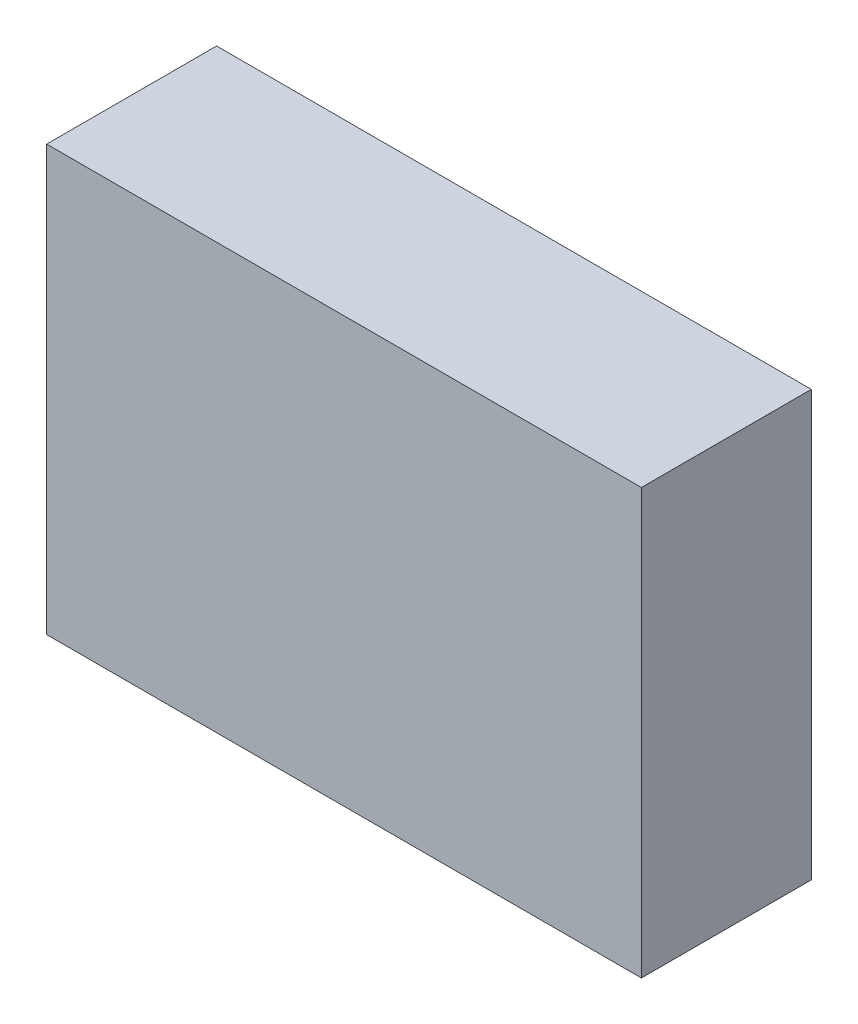
ISO-10303-21;
HEADER;
FILE_DESCRIPTION(('STEP AP214'),'2;1');
FILE_NAME('part.step','',(''),(''),'','','');
FILE_SCHEMA(('AUTOMOTIVE_DESIGN { 1 0 10303 214 1 1 1 1 }'));
ENDSEC;
DATA;
#1=APPLICATION_CONTEXT('core data for automotive mechanical design processes');
#2=APPLICATION_PROTOCOL_DEFINITION('international standard','automotive_design',2000,#1);
#3=PRODUCT_CONTEXT('',#1,'mechanical');
#4=PRODUCT('Part','Part','',(#3));
#5=PRODUCT_RELATED_PRODUCT_CATEGORY('part','',(#4));
#6=PRODUCT_DEFINITION_FORMATION('','',#4);
#7=PRODUCT_DEFINITION_CONTEXT('part definition',#1,'design');
#8=PRODUCT_DEFINITION('design','',#6,#7);
#9=PRODUCT_DEFINITION_SHAPE('','',#8);
#10=(LENGTH_UNIT() NAMED_UNIT(*) SI_UNIT(.MILLI.,.METRE.));
#11=(NAMED_UNIT(*) PLANE_ANGLE_UNIT() SI_UNIT($,.RADIAN.));
#12=(NAMED_UNIT(*) SI_UNIT($,.STERADIAN.) SOLID_ANGLE_UNIT());
#13=UNCERTAINTY_MEASURE_WITH_UNIT(LENGTH_MEASURE(1.E-05),#10,'distance_accuracy_value','');
#14=(GEOMETRIC_REPRESENTATION_CONTEXT(3) GLOBAL_UNCERTAINTY_ASSIGNED_CONTEXT((#13)) GLOBAL_UNIT_ASSIGNED_CONTEXT((#10,
#11,#12)) REPRESENTATION_CONTEXT('',''));
#15=CARTESIAN_POINT('',(0.,0.,0.));
#16=DIRECTION('',(0.,0.,1.));
#17=DIRECTION('',(1.,0.,0.));
#18=AXIS2_PLACEMENT_3D('',#15,#16,#17);
#19=CARTESIAN_POINT('',(0.,0.,20.));
#20=DIRECTION('',(1.,0.,0.));
#21=DIRECTION('',(0.,0.,-1.));
#22=AXIS2_PLACEMENT_3D('',#19,#20,#21);
#23=PLANE('',#22);
#24=DIRECTION('',(0.,-1.,0.));
#25=VECTOR('',#24,1.);
#26=CARTESIAN_POINT('',(0.,0.,0.));
#27=LINE('',#26,#25);
#28=CARTESIAN_POINT('',(0.,50.,0.));
#29=VERTEX_POINT('',#28);
#30=CARTESIAN_POINT('',(0.,0.,0.));
#31=VERTEX_POINT('',#30);
#32=EDGE_CURVE('E107',#29,#31,#27,.T.);
#33=ORIENTED_EDGE('',*,*,#32,.T.);
#34=DIRECTION('',(0.,0.,-1.));
#35=VECTOR('',#34,1.);
#36=CARTESIAN_POINT('',(0.,0.,20.));
#37=LINE('',#36,#35);
#38=CARTESIAN_POINT('',(0.,0.,20.));
#39=VERTEX_POINT('',#38);
#40=EDGE_CURVE('E11',#39,#31,#37,.T.);
#41=ORIENTED_EDGE('',*,*,#40,.F.);
#42=DIRECTION('',(0.,-1.,0.));
#43=VECTOR('',#42,1.);
#44=CARTESIAN_POINT('',(0.,0.,20.));
#45=LINE('',#44,#43);
#46=CARTESIAN_POINT('',(0.,50.,20.));
#47=VERTEX_POINT('',#46);
#48=EDGE_CURVE('E91',#47,#39,#45,.T.);
#49=ORIENTED_EDGE('',*,*,#48,.F.);
#50=DIRECTION('',(0.,0.,-1.));
#51=VECTOR('',#50,1.);
#52=CARTESIAN_POINT('',(0.,50.,20.));
#53=LINE('',#52,#51);
#54=EDGE_CURVE('E103',#47,#29,#53,.T.);
#55=ORIENTED_EDGE('',*,*,#54,.T.);
#56=EDGE_LOOP('',(#33,#41,#49,#55));
#57=FACE_BOUND('',#56,.T.);
#58=ADVANCED_FACE('F39',(#57),#23,.F.);
#59=CARTESIAN_POINT('',(0.,0.,20.));
#60=DIRECTION('',(0.,1.,0.));
#61=DIRECTION('',(0.,0.,1.));
#62=AXIS2_PLACEMENT_3D('',#59,#60,#61);
#63=PLANE('',#62);
#64=DIRECTION('',(1.,0.,0.));
#65=VECTOR('',#64,1.);
#66=CARTESIAN_POINT('',(0.,0.,0.));
#67=LINE('',#66,#65);
#68=CARTESIAN_POINT('',(70.,0.,0.));
#69=VERTEX_POINT('',#68);
#70=EDGE_CURVE('E96',#31,#69,#67,.T.);
#71=ORIENTED_EDGE('',*,*,#70,.T.);
#72=DIRECTION('',(0.,0.,-1.));
#73=VECTOR('',#72,1.);
#74=CARTESIAN_POINT('',(70.,0.,20.));
#75=LINE('',#74,#73);
#76=CARTESIAN_POINT('',(70.,0.,20.));
#77=VERTEX_POINT('',#76);
#78=EDGE_CURVE('E48',#77,#69,#75,.T.);
#79=ORIENTED_EDGE('',*,*,#78,.F.);
#80=DIRECTION('',(1.,0.,0.));
#81=VECTOR('',#80,1.);
#82=CARTESIAN_POINT('',(0.,0.,20.));
#83=LINE('',#82,#81);
#84=EDGE_CURVE('E86',#39,#77,#83,.T.);
#85=ORIENTED_EDGE('',*,*,#84,.F.);
#86=ORIENTED_EDGE('',*,*,#40,.T.);
#87=EDGE_LOOP('',(#71,#79,#85,#86));
#88=FACE_BOUND('',#87,.T.);
#89=ADVANCED_FACE('F95',(#88),#63,.F.);
#90=CARTESIAN_POINT('',(70.,0.,20.));
#91=DIRECTION('',(-1.,0.,0.));
#92=DIRECTION('',(0.,-1.,0.));
#93=AXIS2_PLACEMENT_3D('',#90,#91,#92);
#94=PLANE('',#93);
#95=DIRECTION('',(0.,1.,0.));
#96=VECTOR('',#95,1.);
#97=CARTESIAN_POINT('',(70.,0.,0.));
#98=LINE('',#97,#96);
#99=CARTESIAN_POINT('',(70.,50.,0.));
#100=VERTEX_POINT('',#99);
#101=EDGE_CURVE('E73',#69,#100,#98,.T.);
#102=ORIENTED_EDGE('',*,*,#101,.T.);
#103=DIRECTION('',(0.,0.,-1.));
#104=VECTOR('',#103,1.);
#105=CARTESIAN_POINT('',(70.,50.,20.));
#106=LINE('',#105,#104);
#107=CARTESIAN_POINT('',(70.,50.,20.));
#108=VERTEX_POINT('',#107);
#109=EDGE_CURVE('E98',#108,#100,#106,.T.);
#110=ORIENTED_EDGE('',*,*,#109,.F.);
#111=DIRECTION('',(0.,1.,0.));
#112=VECTOR('',#111,1.);
#113=CARTESIAN_POINT('',(70.,0.,20.));
#114=LINE('',#113,#112);
#115=EDGE_CURVE('E89',#77,#108,#114,.T.);
#116=ORIENTED_EDGE('',*,*,#115,.F.);
#117=ORIENTED_EDGE('',*,*,#78,.T.);
#118=EDGE_LOOP('',(#102,#110,#116,#117));
#119=FACE_BOUND('',#118,.T.);
#120=ADVANCED_FACE('F99',(#119),#94,.F.);
#121=CARTESIAN_POINT('',(0.,50.,20.));
#122=DIRECTION('',(0.,-1.,0.));
#123=DIRECTION('',(0.,0.,-1.));
#124=AXIS2_PLACEMENT_3D('',#121,#122,#123);
#125=PLANE('',#124);
#126=DIRECTION('',(-1.,0.,0.));
#127=VECTOR('',#126,1.);
#128=CARTESIAN_POINT('',(0.,50.,0.));
#129=LINE('',#128,#127);
#130=EDGE_CURVE('E79',#100,#29,#129,.T.);
#131=ORIENTED_EDGE('',*,*,#130,.T.);
#132=ORIENTED_EDGE('',*,*,#54,.F.);
#133=DIRECTION('',(-1.,0.,0.));
#134=VECTOR('',#133,1.);
#135=CARTESIAN_POINT('',(0.,50.,20.));
#136=LINE('',#135,#134);
#137=EDGE_CURVE('E56',#108,#47,#136,.T.);
#138=ORIENTED_EDGE('',*,*,#137,.F.);
#139=ORIENTED_EDGE('',*,*,#109,.T.);
#140=EDGE_LOOP('',(#131,#132,#138,#139));
#141=FACE_BOUND('',#140,.T.);
#142=ADVANCED_FACE('F120',(#141),#125,.F.);
#143=CARTESIAN_POINT('',(0.,0.,20.));
#144=DIRECTION('',(0.,0.,-1.));
#145=DIRECTION('',(-1.,0.,0.));
#146=AXIS2_PLACEMENT_3D('',#143,#144,#145);
#147=PLANE('',#146);
#148=ORIENTED_EDGE('',*,*,#48,.T.);
#149=ORIENTED_EDGE('',*,*,#84,.T.);
#150=ORIENTED_EDGE('',*,*,#115,.T.);
#151=ORIENTED_EDGE('',*,*,#137,.T.);
#152=EDGE_LOOP('',(#148,#149,#150,#151));
#153=FACE_BOUND('',#152,.T.);
#154=ADVANCED_FACE('F87',(#153),#147,.F.);
#155=CARTESIAN_POINT('',(0.,0.,0.));
#156=DIRECTION('',(0.,0.,-1.));
#157=DIRECTION('',(-1.,0.,0.));
#158=AXIS2_PLACEMENT_3D('',#155,#156,#157);
#159=PLANE('',#158);
#160=ORIENTED_EDGE('',*,*,#32,.F.);
#161=ORIENTED_EDGE('',*,*,#130,.F.);
#162=ORIENTED_EDGE('',*,*,#101,.F.);
#163=ORIENTED_EDGE('',*,*,#70,.F.);
#164=EDGE_LOOP('',(#160,#161,#162,#163));
#165=FACE_BOUND('',#164,.T.);
#166=ADVANCED_FACE('F123',(#165),#159,.T.);
#167=CLOSED_SHELL('',(#58,#89,#120,#142,#154,#166));
#168=MANIFOLD_SOLID_BREP('B2',#167);
#169=ADVANCED_BREP_SHAPE_REPRESENTATION('',(#18,#168),#14);
#170=SHAPE_DEFINITION_REPRESENTATION(#9,#169);
ENDSEC;
END-ISO-10303-21;
